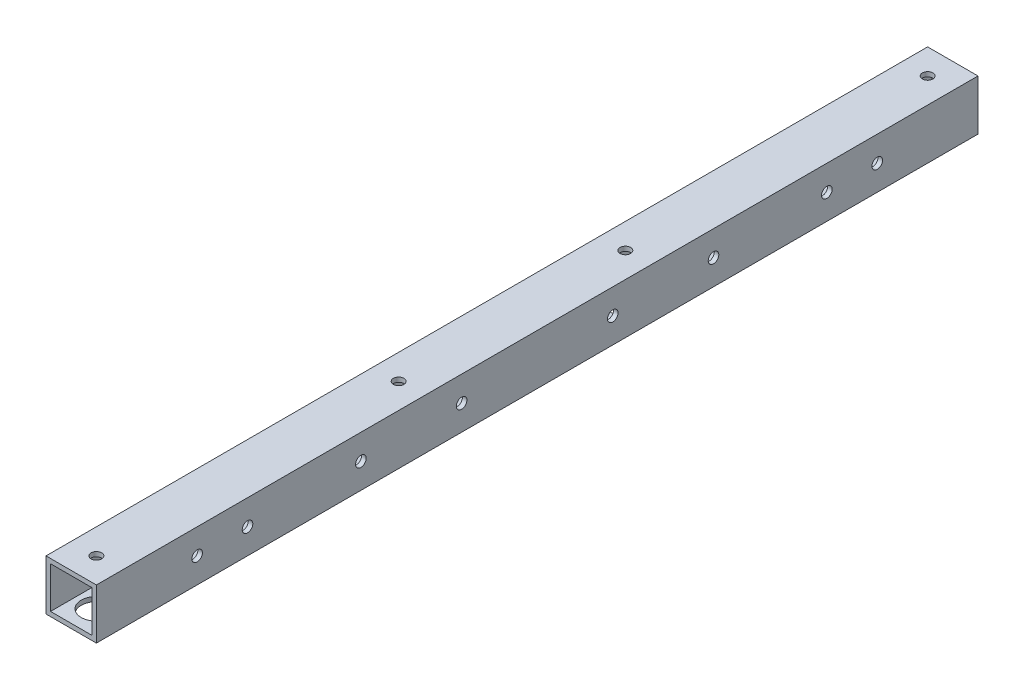
ISO-10303-21;
HEADER;
FILE_DESCRIPTION(('STEP AP214'),'2;1');
FILE_NAME('part.step','',(''),(''),'','','');
FILE_SCHEMA(('AUTOMOTIVE_DESIGN { 1 0 10303 214 1 1 1 1 }'));
ENDSEC;
DATA;
#1=APPLICATION_CONTEXT('core data for automotive mechanical design processes');
#2=APPLICATION_PROTOCOL_DEFINITION('international standard','automotive_design',2000,#1);
#3=PRODUCT_CONTEXT('',#1,'mechanical');
#4=PRODUCT('Part','Part','',(#3));
#5=PRODUCT_RELATED_PRODUCT_CATEGORY('part','',(#4));
#6=PRODUCT_DEFINITION_FORMATION('','',#4);
#7=PRODUCT_DEFINITION_CONTEXT('part definition',#1,'design');
#8=PRODUCT_DEFINITION('design','',#6,#7);
#9=PRODUCT_DEFINITION_SHAPE('','',#8);
#10=(LENGTH_UNIT() NAMED_UNIT(*) SI_UNIT(.MILLI.,.METRE.));
#11=(NAMED_UNIT(*) PLANE_ANGLE_UNIT() SI_UNIT($,.RADIAN.));
#12=(NAMED_UNIT(*) SI_UNIT($,.STERADIAN.) SOLID_ANGLE_UNIT());
#13=UNCERTAINTY_MEASURE_WITH_UNIT(LENGTH_MEASURE(1.E-05),#10,'distance_accuracy_value','');
#14=(GEOMETRIC_REPRESENTATION_CONTEXT(3) GLOBAL_UNCERTAINTY_ASSIGNED_CONTEXT((#13)) GLOBAL_UNIT_ASSIGNED_CONTEXT((#10,
#11,#12)) REPRESENTATION_CONTEXT('',''));
#15=CARTESIAN_POINT('',(0.,0.,0.));
#16=DIRECTION('',(0.,0.,1.));
#17=DIRECTION('',(1.,0.,0.));
#18=AXIS2_PLACEMENT_3D('',#15,#16,#17);
#19=CARTESIAN_POINT('',(0.,0.,-350.));
#20=DIRECTION('',(-1.,0.,0.));
#21=DIRECTION('',(0.,0.,1.));
#22=AXIS2_PLACEMENT_3D('',#19,#20,#21);
#23=PLANE('',#22);
#24=CARTESIAN_POINT('',(0.,10.,-205.));
#25=DIRECTION('',(1.,0.,0.));
#26=DIRECTION('',(0.,0.,-1.));
#27=AXIS2_PLACEMENT_3D('',#24,#25,#26);
#28=CIRCLE('',#27,2.1);
#29=CARTESIAN_POINT('',(0.,10.,-207.1));
#30=VERTEX_POINT('',#29);
#31=EDGE_CURVE('E192',#30,#30,#28,.T.);
#32=ORIENTED_EDGE('',*,*,#31,.T.);
#33=EDGE_LOOP('',(#32));
#34=FACE_BOUND('',#33,.T.);
#35=CARTESIAN_POINT('',(0.,9.99999999999972,-245.));
#36=DIRECTION('',(1.,0.,0.));
#37=DIRECTION('',(0.,0.,-1.));
#38=AXIS2_PLACEMENT_3D('',#35,#36,#37);
#39=CIRCLE('',#38,2.1);
#40=CARTESIAN_POINT('',(0.,9.99999999999972,-247.1));
#41=VERTEX_POINT('',#40);
#42=EDGE_CURVE('E229',#41,#41,#39,.T.);
#43=ORIENTED_EDGE('',*,*,#42,.T.);
#44=EDGE_LOOP('',(#43));
#45=FACE_BOUND('',#44,.T.);
#46=CARTESIAN_POINT('',(0.,10.,-145.));
#47=DIRECTION('',(1.,0.,0.));
#48=DIRECTION('',(0.,0.,-1.));
#49=AXIS2_PLACEMENT_3D('',#46,#47,#48);
#50=CIRCLE('',#49,2.1);
#51=CARTESIAN_POINT('',(0.,10.,-147.1));
#52=VERTEX_POINT('',#51);
#53=EDGE_CURVE('E241',#52,#52,#50,.T.);
#54=ORIENTED_EDGE('',*,*,#53,.T.);
#55=EDGE_LOOP('',(#54));
#56=FACE_BOUND('',#55,.T.);
#57=CARTESIAN_POINT('',(0.,9.99999999999972,-105.));
#58=DIRECTION('',(1.,0.,0.));
#59=DIRECTION('',(0.,0.,-1.));
#60=AXIS2_PLACEMENT_3D('',#57,#58,#59);
#61=CIRCLE('',#60,2.1);
#62=CARTESIAN_POINT('',(0.,9.99999999999972,-107.1));
#63=VERTEX_POINT('',#62);
#64=EDGE_CURVE('E253',#63,#63,#61,.T.);
#65=ORIENTED_EDGE('',*,*,#64,.T.);
#66=EDGE_LOOP('',(#65));
#67=FACE_BOUND('',#66,.T.);
#68=CARTESIAN_POINT('',(0.,10.,-290.));
#69=DIRECTION('',(1.,0.,0.));
#70=DIRECTION('',(0.,0.,-1.));
#71=AXIS2_PLACEMENT_3D('',#68,#69,#70);
#72=CIRCLE('',#71,2.1);
#73=CARTESIAN_POINT('',(0.,10.,-292.1));
#74=VERTEX_POINT('',#73);
#75=EDGE_CURVE('E188',#74,#74,#72,.T.);
#76=ORIENTED_EDGE('',*,*,#75,.T.);
#77=EDGE_LOOP('',(#76));
#78=FACE_BOUND('',#77,.T.);
#79=CARTESIAN_POINT('',(0.,10.,-310.));
#80=DIRECTION('',(1.,0.,0.));
#81=DIRECTION('',(0.,0.,-1.));
#82=AXIS2_PLACEMENT_3D('',#79,#80,#81);
#83=CIRCLE('',#82,2.1);
#84=CARTESIAN_POINT('',(0.,10.,-312.1));
#85=VERTEX_POINT('',#84);
#86=EDGE_CURVE('E183',#85,#85,#83,.T.);
#87=ORIENTED_EDGE('',*,*,#86,.T.);
#88=EDGE_LOOP('',(#87));
#89=FACE_BOUND('',#88,.T.);
#90=CARTESIAN_POINT('',(0.,10.,-60.));
#91=DIRECTION('',(1.,0.,0.));
#92=DIRECTION('',(0.,0.,-1.));
#93=AXIS2_PLACEMENT_3D('',#90,#91,#92);
#94=CIRCLE('',#93,2.1);
#95=CARTESIAN_POINT('',(0.,10.,-62.1));
#96=VERTEX_POINT('',#95);
#97=EDGE_CURVE('E178',#96,#96,#94,.T.);
#98=ORIENTED_EDGE('',*,*,#97,.T.);
#99=EDGE_LOOP('',(#98));
#100=FACE_BOUND('',#99,.T.);
#101=CARTESIAN_POINT('',(0.,10.,-40.));
#102=DIRECTION('',(1.,0.,0.));
#103=DIRECTION('',(0.,0.,-1.));
#104=AXIS2_PLACEMENT_3D('',#101,#102,#103);
#105=CIRCLE('',#104,2.1);
#106=CARTESIAN_POINT('',(0.,10.,-42.1));
#107=VERTEX_POINT('',#106);
#108=EDGE_CURVE('E173',#107,#107,#105,.T.);
#109=ORIENTED_EDGE('',*,*,#108,.T.);
#110=EDGE_LOOP('',(#109));
#111=FACE_BOUND('',#110,.T.);
#112=DIRECTION('',(0.,-1.,0.));
#113=VECTOR('',#112,1.);
#114=CARTESIAN_POINT('',(0.,0.,0.));
#115=LINE('',#114,#113);
#116=CARTESIAN_POINT('',(0.,20.,0.));
#117=VERTEX_POINT('',#116);
#118=CARTESIAN_POINT('',(0.,0.,0.));
#119=VERTEX_POINT('',#118);
#120=EDGE_CURVE('E138',#117,#119,#115,.T.);
#121=ORIENTED_EDGE('',*,*,#120,.F.);
#122=DIRECTION('',(0.,0.,1.));
#123=VECTOR('',#122,1.);
#124=CARTESIAN_POINT('',(0.,20.,-350.));
#125=LINE('',#124,#123);
#126=CARTESIAN_POINT('',(0.,20.,-350.));
#127=VERTEX_POINT('',#126);
#128=EDGE_CURVE('E11',#127,#117,#125,.T.);
#129=ORIENTED_EDGE('',*,*,#128,.F.);
#130=DIRECTION('',(0.,-1.,0.));
#131=VECTOR('',#130,1.);
#132=CARTESIAN_POINT('',(0.,0.,-350.));
#133=LINE('',#132,#131);
#134=CARTESIAN_POINT('',(0.,0.,-350.));
#135=VERTEX_POINT('',#134);
#136=EDGE_CURVE('E142',#127,#135,#133,.T.);
#137=ORIENTED_EDGE('',*,*,#136,.T.);
#138=DIRECTION('',(0.,0.,1.));
#139=VECTOR('',#138,1.);
#140=CARTESIAN_POINT('',(0.,0.,-350.));
#141=LINE('',#140,#139);
#142=EDGE_CURVE('E155',#135,#119,#141,.T.);
#143=ORIENTED_EDGE('',*,*,#142,.T.);
#144=EDGE_LOOP('',(#121,#129,#137,#143));
#145=FACE_BOUND('',#144,.T.);
#146=ADVANCED_FACE('F37',(#34,#45,#56,#67,#78,#89,#100,#111,#145),#23,.T.);
#147=CARTESIAN_POINT('',(0.,20.,-350.));
#148=DIRECTION('',(0.,1.,0.));
#149=DIRECTION('',(0.,0.,1.));
#150=AXIS2_PLACEMENT_3D('',#147,#148,#149);
#151=PLANE('',#150);
#152=CARTESIAN_POINT('',(10.,20.,-220.));
#153=DIRECTION('',(0.,1.,0.));
#154=DIRECTION('',(0.,0.,1.));
#155=AXIS2_PLACEMENT_3D('',#152,#153,#154);
#156=CIRCLE('',#155,2.09999999999999);
#157=CARTESIAN_POINT('',(10.,20.,-217.9));
#158=VERTEX_POINT('',#157);
#159=EDGE_CURVE('E701',#158,#158,#156,.T.);
#160=ORIENTED_EDGE('',*,*,#159,.F.);
#161=EDGE_LOOP('',(#160));
#162=FACE_BOUND('',#161,.T.);
#163=CARTESIAN_POINT('',(10.,20.,-130.));
#164=DIRECTION('',(0.,1.,0.));
#165=DIRECTION('',(0.,0.,1.));
#166=AXIS2_PLACEMENT_3D('',#163,#164,#165);
#167=CIRCLE('',#166,2.09999999999999);
#168=CARTESIAN_POINT('',(10.,20.,-127.9));
#169=VERTEX_POINT('',#168);
#170=EDGE_CURVE('E714',#169,#169,#167,.T.);
#171=ORIENTED_EDGE('',*,*,#170,.F.);
#172=EDGE_LOOP('',(#171));
#173=FACE_BOUND('',#172,.T.);
#174=CARTESIAN_POINT('',(10.,20.,-340.));
#175=DIRECTION('',(0.,1.,0.));
#176=DIRECTION('',(0.,0.,1.));
#177=AXIS2_PLACEMENT_3D('',#174,#175,#176);
#178=CIRCLE('',#177,2.09999999999999);
#179=CARTESIAN_POINT('',(10.,20.,-337.9));
#180=VERTEX_POINT('',#179);
#181=EDGE_CURVE('E207',#180,#180,#178,.T.);
#182=ORIENTED_EDGE('',*,*,#181,.F.);
#183=EDGE_LOOP('',(#182));
#184=FACE_BOUND('',#183,.T.);
#185=CARTESIAN_POINT('',(10.,20.,-10.));
#186=DIRECTION('',(0.,1.,0.));
#187=DIRECTION('',(0.,0.,1.));
#188=AXIS2_PLACEMENT_3D('',#185,#186,#187);
#189=CIRCLE('',#188,2.09999999999999);
#190=CARTESIAN_POINT('',(10.,20.,-7.90000000000001));
#191=VERTEX_POINT('',#190);
#192=EDGE_CURVE('E196',#191,#191,#189,.T.);
#193=ORIENTED_EDGE('',*,*,#192,.F.);
#194=EDGE_LOOP('',(#193));
#195=FACE_BOUND('',#194,.T.);
#196=DIRECTION('',(-1.,0.,0.));
#197=VECTOR('',#196,1.);
#198=CARTESIAN_POINT('',(0.,20.,0.));
#199=LINE('',#198,#197);
#200=CARTESIAN_POINT('',(20.,20.,0.));
#201=VERTEX_POINT('',#200);
#202=EDGE_CURVE('E146',#201,#117,#199,.T.);
#203=ORIENTED_EDGE('',*,*,#202,.F.);
#204=DIRECTION('',(0.,0.,1.));
#205=VECTOR('',#204,1.);
#206=CARTESIAN_POINT('',(20.,20.,-350.));
#207=LINE('',#206,#205);
#208=CARTESIAN_POINT('',(20.,20.,-350.));
#209=VERTEX_POINT('',#208);
#210=EDGE_CURVE('E45',#209,#201,#207,.T.);
#211=ORIENTED_EDGE('',*,*,#210,.F.);
#212=DIRECTION('',(-1.,0.,0.));
#213=VECTOR('',#212,1.);
#214=CARTESIAN_POINT('',(0.,20.,-350.));
#215=LINE('',#214,#213);
#216=EDGE_CURVE('E152',#209,#127,#215,.T.);
#217=ORIENTED_EDGE('',*,*,#216,.T.);
#218=ORIENTED_EDGE('',*,*,#128,.T.);
#219=EDGE_LOOP('',(#203,#211,#217,#218));
#220=FACE_BOUND('',#219,.T.);
#221=ADVANCED_FACE('F319',(#162,#173,#184,#195,#220),#151,.T.);
#222=CARTESIAN_POINT('',(20.,20.,-350.));
#223=DIRECTION('',(1.,0.,0.));
#224=DIRECTION('',(0.,1.,0.));
#225=AXIS2_PLACEMENT_3D('',#222,#223,#224);
#226=PLANE('',#225);
#227=CARTESIAN_POINT('',(20.,10.,-205.));
#228=DIRECTION('',(1.,0.,0.));
#229=DIRECTION('',(0.,0.,-1.));
#230=AXIS2_PLACEMENT_3D('',#227,#228,#229);
#231=CIRCLE('',#230,2.09999999999999);
#232=CARTESIAN_POINT('',(20.,10.,-207.1));
#233=VERTEX_POINT('',#232);
#234=EDGE_CURVE('E216',#233,#233,#231,.T.);
#235=ORIENTED_EDGE('',*,*,#234,.F.);
#236=EDGE_LOOP('',(#235));
#237=FACE_BOUND('',#236,.T.);
#238=CARTESIAN_POINT('',(20.,9.99999999999972,-245.));
#239=DIRECTION('',(1.,0.,0.));
#240=DIRECTION('',(0.,0.,-1.));
#241=AXIS2_PLACEMENT_3D('',#238,#239,#240);
#242=CIRCLE('',#241,2.09999999999999);
#243=CARTESIAN_POINT('',(20.,9.99999999999972,-247.1));
#244=VERTEX_POINT('',#243);
#245=EDGE_CURVE('E226',#244,#244,#242,.T.);
#246=ORIENTED_EDGE('',*,*,#245,.F.);
#247=EDGE_LOOP('',(#246));
#248=FACE_BOUND('',#247,.T.);
#249=CARTESIAN_POINT('',(20.,10.,-145.));
#250=DIRECTION('',(1.,0.,0.));
#251=DIRECTION('',(0.,0.,-1.));
#252=AXIS2_PLACEMENT_3D('',#249,#250,#251);
#253=CIRCLE('',#252,2.09999999999999);
#254=CARTESIAN_POINT('',(20.,10.,-147.1));
#255=VERTEX_POINT('',#254);
#256=EDGE_CURVE('E238',#255,#255,#253,.T.);
#257=ORIENTED_EDGE('',*,*,#256,.F.);
#258=EDGE_LOOP('',(#257));
#259=FACE_BOUND('',#258,.T.);
#260=CARTESIAN_POINT('',(20.,9.99999999999972,-105.));
#261=DIRECTION('',(1.,0.,0.));
#262=DIRECTION('',(0.,0.,-1.));
#263=AXIS2_PLACEMENT_3D('',#260,#261,#262);
#264=CIRCLE('',#263,2.09999999999999);
#265=CARTESIAN_POINT('',(20.,9.99999999999972,-107.1));
#266=VERTEX_POINT('',#265);
#267=EDGE_CURVE('E250',#266,#266,#264,.T.);
#268=ORIENTED_EDGE('',*,*,#267,.F.);
#269=EDGE_LOOP('',(#268));
#270=FACE_BOUND('',#269,.T.);
#271=CARTESIAN_POINT('',(20.,10.,-290.));
#272=DIRECTION('',(1.,0.,0.));
#273=DIRECTION('',(0.,0.,-1.));
#274=AXIS2_PLACEMENT_3D('',#271,#272,#273);
#275=CIRCLE('',#274,2.09999999999999);
#276=CARTESIAN_POINT('',(20.,10.,-292.1));
#277=VERTEX_POINT('',#276);
#278=EDGE_CURVE('E262',#277,#277,#275,.T.);
#279=ORIENTED_EDGE('',*,*,#278,.F.);
#280=EDGE_LOOP('',(#279));
#281=FACE_BOUND('',#280,.T.);
#282=CARTESIAN_POINT('',(20.,10.,-310.));
#283=DIRECTION('',(1.,0.,0.));
#284=DIRECTION('',(0.,0.,-1.));
#285=AXIS2_PLACEMENT_3D('',#282,#283,#284);
#286=CIRCLE('',#285,2.09999999999999);
#287=CARTESIAN_POINT('',(20.,10.,-312.1));
#288=VERTEX_POINT('',#287);
#289=EDGE_CURVE('E269',#288,#288,#286,.T.);
#290=ORIENTED_EDGE('',*,*,#289,.F.);
#291=EDGE_LOOP('',(#290));
#292=FACE_BOUND('',#291,.T.);
#293=CARTESIAN_POINT('',(20.,10.,-60.));
#294=DIRECTION('',(1.,0.,0.));
#295=DIRECTION('',(0.,0.,-1.));
#296=AXIS2_PLACEMENT_3D('',#293,#294,#295);
#297=CIRCLE('',#296,2.09999999999999);
#298=CARTESIAN_POINT('',(20.,10.,-62.1));
#299=VERTEX_POINT('',#298);
#300=EDGE_CURVE('E276',#299,#299,#297,.T.);
#301=ORIENTED_EDGE('',*,*,#300,.F.);
#302=EDGE_LOOP('',(#301));
#303=FACE_BOUND('',#302,.T.);
#304=CARTESIAN_POINT('',(20.,10.,-40.));
#305=DIRECTION('',(1.,0.,0.));
#306=DIRECTION('',(0.,0.,-1.));
#307=AXIS2_PLACEMENT_3D('',#304,#305,#306);
#308=CIRCLE('',#307,2.09999999999999);
#309=CARTESIAN_POINT('',(20.,10.,-42.1));
#310=VERTEX_POINT('',#309);
#311=EDGE_CURVE('E283',#310,#310,#308,.T.);
#312=ORIENTED_EDGE('',*,*,#311,.F.);
#313=EDGE_LOOP('',(#312));
#314=FACE_BOUND('',#313,.T.);
#315=DIRECTION('',(0.,1.,0.));
#316=VECTOR('',#315,1.);
#317=CARTESIAN_POINT('',(20.,20.,0.));
#318=LINE('',#317,#316);
#319=CARTESIAN_POINT('',(20.,0.,0.));
#320=VERTEX_POINT('',#319);
#321=EDGE_CURVE('E161',#320,#201,#318,.T.);
#322=ORIENTED_EDGE('',*,*,#321,.F.);
#323=DIRECTION('',(0.,0.,1.));
#324=VECTOR('',#323,1.);
#325=CARTESIAN_POINT('',(20.,0.,-350.));
#326=LINE('',#325,#324);
#327=CARTESIAN_POINT('',(20.,0.,-350.));
#328=VERTEX_POINT('',#327);
#329=EDGE_CURVE('E167',#328,#320,#326,.T.);
#330=ORIENTED_EDGE('',*,*,#329,.F.);
#331=DIRECTION('',(0.,1.,0.));
#332=VECTOR('',#331,1.);
#333=CARTESIAN_POINT('',(20.,20.,-350.));
#334=LINE('',#333,#332);
#335=EDGE_CURVE('E149',#328,#209,#334,.T.);
#336=ORIENTED_EDGE('',*,*,#335,.T.);
#337=ORIENTED_EDGE('',*,*,#210,.T.);
#338=EDGE_LOOP('',(#322,#330,#336,#337));
#339=FACE_BOUND('',#338,.T.);
#340=ADVANCED_FACE('F325',(#237,#248,#259,#270,#281,#292,#303,#314,#339),#226,.T.);
#341=CARTESIAN_POINT('',(0.,0.,-350.));
#342=DIRECTION('',(0.,-1.,0.));
#343=DIRECTION('',(0.,0.,-1.));
#344=AXIS2_PLACEMENT_3D('',#341,#342,#343);
#345=PLANE('',#344);
#346=CARTESIAN_POINT('',(10.,0.,-130.));
#347=DIRECTION('',(0.,-1.,0.));
#348=DIRECTION('',(0.,0.,-1.));
#349=AXIS2_PLACEMENT_3D('',#346,#347,#348);
#350=CIRCLE('',#349,6.);
#351=CARTESIAN_POINT('',(10.,0.,-136.));
#352=VERTEX_POINT('',#351);
#353=EDGE_CURVE('E700',#352,#352,#350,.T.);
#354=ORIENTED_EDGE('',*,*,#353,.F.);
#355=EDGE_LOOP('',(#354));
#356=FACE_BOUND('',#355,.T.);
#357=CARTESIAN_POINT('',(10.,0.,-220.));
#358=DIRECTION('',(0.,-1.,0.));
#359=DIRECTION('',(0.,0.,-1.));
#360=AXIS2_PLACEMENT_3D('',#357,#358,#359);
#361=CIRCLE('',#360,6.);
#362=CARTESIAN_POINT('',(10.,0.,-226.));
#363=VERTEX_POINT('',#362);
#364=EDGE_CURVE('E708',#363,#363,#361,.T.);
#365=ORIENTED_EDGE('',*,*,#364,.F.);
#366=EDGE_LOOP('',(#365));
#367=FACE_BOUND('',#366,.T.);
#368=CARTESIAN_POINT('',(10.,0.,-10.));
#369=DIRECTION('',(0.,-1.,0.));
#370=DIRECTION('',(0.,0.,-1.));
#371=AXIS2_PLACEMENT_3D('',#368,#369,#370);
#372=CIRCLE('',#371,6.);
#373=CARTESIAN_POINT('',(10.,0.,-16.));
#374=VERTEX_POINT('',#373);
#375=EDGE_CURVE('E214',#374,#374,#372,.T.);
#376=ORIENTED_EDGE('',*,*,#375,.F.);
#377=EDGE_LOOP('',(#376));
#378=FACE_BOUND('',#377,.T.);
#379=CARTESIAN_POINT('',(10.,0.,-340.));
#380=DIRECTION('',(0.,-1.,0.));
#381=DIRECTION('',(0.,0.,-1.));
#382=AXIS2_PLACEMENT_3D('',#379,#380,#381);
#383=CIRCLE('',#382,6.);
#384=CARTESIAN_POINT('',(10.,0.,-346.));
#385=VERTEX_POINT('',#384);
#386=EDGE_CURVE('E200',#385,#385,#383,.T.);
#387=ORIENTED_EDGE('',*,*,#386,.F.);
#388=EDGE_LOOP('',(#387));
#389=FACE_BOUND('',#388,.T.);
#390=DIRECTION('',(1.,0.,0.));
#391=VECTOR('',#390,1.);
#392=CARTESIAN_POINT('',(0.,0.,0.));
#393=LINE('',#392,#391);
#394=EDGE_CURVE('E158',#119,#320,#393,.T.);
#395=ORIENTED_EDGE('',*,*,#394,.F.);
#396=ORIENTED_EDGE('',*,*,#142,.F.);
#397=DIRECTION('',(1.,0.,0.));
#398=VECTOR('',#397,1.);
#399=CARTESIAN_POINT('',(0.,0.,-350.));
#400=LINE('',#399,#398);
#401=EDGE_CURVE('E145',#135,#328,#400,.T.);
#402=ORIENTED_EDGE('',*,*,#401,.T.);
#403=ORIENTED_EDGE('',*,*,#329,.T.);
#404=EDGE_LOOP('',(#395,#396,#402,#403));
#405=FACE_BOUND('',#404,.T.);
#406=ADVANCED_FACE('F450',(#356,#367,#378,#389,#405),#345,.T.);
#407=CARTESIAN_POINT('',(0.,20.,-350.));
#408=DIRECTION('',(0.,0.,-1.));
#409=DIRECTION('',(-1.,0.,0.));
#410=AXIS2_PLACEMENT_3D('',#407,#408,#409);
#411=PLANE('',#410);
#412=DIRECTION('',(0.,-1.,0.));
#413=VECTOR('',#412,1.);
#414=CARTESIAN_POINT('',(1.8,1.8,-350.));
#415=LINE('',#414,#413);
#416=CARTESIAN_POINT('',(1.8,18.2,-350.));
#417=VERTEX_POINT('',#416);
#418=CARTESIAN_POINT('',(1.8,1.8,-350.));
#419=VERTEX_POINT('',#418);
#420=EDGE_CURVE('E104',#417,#419,#415,.T.);
#421=ORIENTED_EDGE('',*,*,#420,.T.);
#422=DIRECTION('',(1.,0.,0.));
#423=VECTOR('',#422,1.);
#424=CARTESIAN_POINT('',(1.8,1.8,-350.));
#425=LINE('',#424,#423);
#426=CARTESIAN_POINT('',(18.2,1.8,-350.));
#427=VERTEX_POINT('',#426);
#428=EDGE_CURVE('E113',#419,#427,#425,.T.);
#429=ORIENTED_EDGE('',*,*,#428,.T.);
#430=DIRECTION('',(0.,1.,0.));
#431=VECTOR('',#430,1.);
#432=CARTESIAN_POINT('',(18.2,18.2,-350.));
#433=LINE('',#432,#431);
#434=CARTESIAN_POINT('',(18.2,18.2,-350.));
#435=VERTEX_POINT('',#434);
#436=EDGE_CURVE('E53',#427,#435,#433,.T.);
#437=ORIENTED_EDGE('',*,*,#436,.T.);
#438=DIRECTION('',(-1.,0.,0.));
#439=VECTOR('',#438,1.);
#440=CARTESIAN_POINT('',(1.8,18.2,-350.));
#441=LINE('',#440,#439);
#442=EDGE_CURVE('E110',#435,#417,#441,.T.);
#443=ORIENTED_EDGE('',*,*,#442,.T.);
#444=EDGE_LOOP('',(#421,#429,#437,#443));
#445=FACE_BOUND('',#444,.T.);
#446=ORIENTED_EDGE('',*,*,#136,.F.);
#447=ORIENTED_EDGE('',*,*,#216,.F.);
#448=ORIENTED_EDGE('',*,*,#335,.F.);
#449=ORIENTED_EDGE('',*,*,#401,.F.);
#450=EDGE_LOOP('',(#446,#447,#448,#449));
#451=FACE_BOUND('',#450,.T.);
#452=ADVANCED_FACE('F117',(#445,#451),#411,.T.);
#453=CARTESIAN_POINT('',(0.,20.,0.));
#454=DIRECTION('',(0.,0.,-1.));
#455=DIRECTION('',(-1.,0.,0.));
#456=AXIS2_PLACEMENT_3D('',#453,#454,#455);
#457=PLANE('',#456);
#458=DIRECTION('',(1.,0.,0.));
#459=VECTOR('',#458,1.);
#460=CARTESIAN_POINT('',(1.8,1.8,0.));
#461=LINE('',#460,#459);
#462=CARTESIAN_POINT('',(1.8,1.8,0.));
#463=VERTEX_POINT('',#462);
#464=CARTESIAN_POINT('',(18.2,1.8,0.));
#465=VERTEX_POINT('',#464);
#466=EDGE_CURVE('E132',#463,#465,#461,.T.);
#467=ORIENTED_EDGE('',*,*,#466,.F.);
#468=DIRECTION('',(0.,-1.,0.));
#469=VECTOR('',#468,1.);
#470=CARTESIAN_POINT('',(1.8,1.8,0.));
#471=LINE('',#470,#469);
#472=CARTESIAN_POINT('',(1.8,18.2,0.));
#473=VERTEX_POINT('',#472);
#474=EDGE_CURVE('E61',#473,#463,#471,.T.);
#475=ORIENTED_EDGE('',*,*,#474,.F.);
#476=DIRECTION('',(-1.,0.,0.));
#477=VECTOR('',#476,1.);
#478=CARTESIAN_POINT('',(1.8,18.2,0.));
#479=LINE('',#478,#477);
#480=CARTESIAN_POINT('',(18.2,18.2,0.));
#481=VERTEX_POINT('',#480);
#482=EDGE_CURVE('E120',#481,#473,#479,.T.);
#483=ORIENTED_EDGE('',*,*,#482,.F.);
#484=DIRECTION('',(0.,1.,0.));
#485=VECTOR('',#484,1.);
#486=CARTESIAN_POINT('',(18.2,18.2,0.));
#487=LINE('',#486,#485);
#488=EDGE_CURVE('E123',#465,#481,#487,.T.);
#489=ORIENTED_EDGE('',*,*,#488,.F.);
#490=EDGE_LOOP('',(#467,#475,#483,#489));
#491=FACE_BOUND('',#490,.T.);
#492=ORIENTED_EDGE('',*,*,#120,.T.);
#493=ORIENTED_EDGE('',*,*,#394,.T.);
#494=ORIENTED_EDGE('',*,*,#321,.T.);
#495=ORIENTED_EDGE('',*,*,#202,.T.);
#496=EDGE_LOOP('',(#492,#493,#494,#495));
#497=FACE_BOUND('',#496,.T.);
#498=ADVANCED_FACE('F301',(#491,#497),#457,.F.);
#499=CARTESIAN_POINT('',(1.8,1.8,-350.));
#500=DIRECTION('',(-1.,0.,0.));
#501=DIRECTION('',(0.,0.,1.));
#502=AXIS2_PLACEMENT_3D('',#499,#500,#501);
#503=PLANE('',#502);
#504=CARTESIAN_POINT('',(1.8,10.,-205.));
#505=DIRECTION('',(-1.,0.,0.));
#506=DIRECTION('',(0.,0.,1.));
#507=AXIS2_PLACEMENT_3D('',#504,#505,#506);
#508=CIRCLE('',#507,2.09999999999999);
#509=CARTESIAN_POINT('',(1.8,10.,-202.9));
#510=VERTEX_POINT('',#509);
#511=EDGE_CURVE('E191',#510,#510,#508,.T.);
#512=ORIENTED_EDGE('',*,*,#511,.T.);
#513=EDGE_LOOP('',(#512));
#514=FACE_BOUND('',#513,.T.);
#515=CARTESIAN_POINT('',(1.8,9.99999999999972,-245.));
#516=DIRECTION('',(-1.,0.,0.));
#517=DIRECTION('',(0.,0.,1.));
#518=AXIS2_PLACEMENT_3D('',#515,#516,#517);
#519=CIRCLE('',#518,2.09999999999999);
#520=CARTESIAN_POINT('',(1.8,9.99999999999972,-242.9));
#521=VERTEX_POINT('',#520);
#522=EDGE_CURVE('E232',#521,#521,#519,.T.);
#523=ORIENTED_EDGE('',*,*,#522,.T.);
#524=EDGE_LOOP('',(#523));
#525=FACE_BOUND('',#524,.T.);
#526=CARTESIAN_POINT('',(1.8,10.,-145.));
#527=DIRECTION('',(-1.,0.,0.));
#528=DIRECTION('',(0.,0.,1.));
#529=AXIS2_PLACEMENT_3D('',#526,#527,#528);
#530=CIRCLE('',#529,2.09999999999999);
#531=CARTESIAN_POINT('',(1.8,10.,-142.9));
#532=VERTEX_POINT('',#531);
#533=EDGE_CURVE('E247',#532,#532,#530,.T.);
#534=ORIENTED_EDGE('',*,*,#533,.T.);
#535=EDGE_LOOP('',(#534));
#536=FACE_BOUND('',#535,.T.);
#537=CARTESIAN_POINT('',(1.8,9.99999999999972,-105.));
#538=DIRECTION('',(-1.,0.,0.));
#539=DIRECTION('',(0.,0.,1.));
#540=AXIS2_PLACEMENT_3D('',#537,#538,#539);
#541=CIRCLE('',#540,2.09999999999999);
#542=CARTESIAN_POINT('',(1.8,9.99999999999972,-102.9));
#543=VERTEX_POINT('',#542);
#544=EDGE_CURVE('E259',#543,#543,#541,.T.);
#545=ORIENTED_EDGE('',*,*,#544,.T.);
#546=EDGE_LOOP('',(#545));
#547=FACE_BOUND('',#546,.T.);
#548=CARTESIAN_POINT('',(1.8,10.,-290.));
#549=DIRECTION('',(-1.,0.,0.));
#550=DIRECTION('',(0.,0.,1.));
#551=AXIS2_PLACEMENT_3D('',#548,#549,#550);
#552=CIRCLE('',#551,2.09999999999999);
#553=CARTESIAN_POINT('',(1.8,10.,-287.9));
#554=VERTEX_POINT('',#553);
#555=EDGE_CURVE('E187',#554,#554,#552,.T.);
#556=ORIENTED_EDGE('',*,*,#555,.T.);
#557=EDGE_LOOP('',(#556));
#558=FACE_BOUND('',#557,.T.);
#559=CARTESIAN_POINT('',(1.8,10.,-310.));
#560=DIRECTION('',(-1.,0.,0.));
#561=DIRECTION('',(0.,0.,1.));
#562=AXIS2_PLACEMENT_3D('',#559,#560,#561);
#563=CIRCLE('',#562,2.09999999999999);
#564=CARTESIAN_POINT('',(1.8,10.,-307.9));
#565=VERTEX_POINT('',#564);
#566=EDGE_CURVE('E182',#565,#565,#563,.T.);
#567=ORIENTED_EDGE('',*,*,#566,.T.);
#568=EDGE_LOOP('',(#567));
#569=FACE_BOUND('',#568,.T.);
#570=CARTESIAN_POINT('',(1.8,10.,-60.));
#571=DIRECTION('',(-1.,0.,0.));
#572=DIRECTION('',(0.,0.,1.));
#573=AXIS2_PLACEMENT_3D('',#570,#571,#572);
#574=CIRCLE('',#573,2.09999999999999);
#575=CARTESIAN_POINT('',(1.8,10.,-57.9));
#576=VERTEX_POINT('',#575);
#577=EDGE_CURVE('E174',#576,#576,#574,.T.);
#578=ORIENTED_EDGE('',*,*,#577,.T.);
#579=EDGE_LOOP('',(#578));
#580=FACE_BOUND('',#579,.T.);
#581=CARTESIAN_POINT('',(1.8,10.,-40.));
#582=DIRECTION('',(-1.,0.,0.));
#583=DIRECTION('',(0.,0.,1.));
#584=AXIS2_PLACEMENT_3D('',#581,#582,#583);
#585=CIRCLE('',#584,2.09999999999999);
#586=CARTESIAN_POINT('',(1.8,10.,-37.9));
#587=VERTEX_POINT('',#586);
#588=EDGE_CURVE('E126',#587,#587,#585,.T.);
#589=ORIENTED_EDGE('',*,*,#588,.T.);
#590=EDGE_LOOP('',(#589));
#591=FACE_BOUND('',#590,.T.);
#592=ORIENTED_EDGE('',*,*,#474,.T.);
#593=DIRECTION('',(0.,0.,1.));
#594=VECTOR('',#593,1.);
#595=CARTESIAN_POINT('',(1.8,1.8,-350.));
#596=LINE('',#595,#594);
#597=EDGE_CURVE('E100',#419,#463,#596,.T.);
#598=ORIENTED_EDGE('',*,*,#597,.F.);
#599=ORIENTED_EDGE('',*,*,#420,.F.);
#600=DIRECTION('',(0.,0.,1.));
#601=VECTOR('',#600,1.);
#602=CARTESIAN_POINT('',(1.8,18.2,-350.));
#603=LINE('',#602,#601);
#604=EDGE_CURVE('E136',#417,#473,#603,.T.);
#605=ORIENTED_EDGE('',*,*,#604,.T.);
#606=EDGE_LOOP('',(#592,#598,#599,#605));
#607=FACE_BOUND('',#606,.T.);
#608=ADVANCED_FACE('F102',(#514,#525,#536,#547,#558,#569,#580,#591,#607),#503,.F.);
#609=CARTESIAN_POINT('',(1.8,18.2,-350.));
#610=DIRECTION('',(0.,1.,0.));
#611=DIRECTION('',(0.,0.,1.));
#612=AXIS2_PLACEMENT_3D('',#609,#610,#611);
#613=PLANE('',#612);
#614=CARTESIAN_POINT('',(10.,18.2,-220.));
#615=DIRECTION('',(0.,1.,0.));
#616=DIRECTION('',(0.,0.,1.));
#617=AXIS2_PLACEMENT_3D('',#614,#615,#616);
#618=CIRCLE('',#617,2.09999999999999);
#619=CARTESIAN_POINT('',(10.,18.2,-217.9));
#620=VERTEX_POINT('',#619);
#621=EDGE_CURVE('E704',#620,#620,#618,.T.);
#622=ORIENTED_EDGE('',*,*,#621,.T.);
#623=EDGE_LOOP('',(#622));
#624=FACE_BOUND('',#623,.T.);
#625=CARTESIAN_POINT('',(10.,18.2,-130.));
#626=DIRECTION('',(0.,1.,0.));
#627=DIRECTION('',(0.,0.,1.));
#628=AXIS2_PLACEMENT_3D('',#625,#626,#627);
#629=CIRCLE('',#628,2.09999999999999);
#630=CARTESIAN_POINT('',(10.,18.2,-127.9));
#631=VERTEX_POINT('',#630);
#632=EDGE_CURVE('E716',#631,#631,#629,.T.);
#633=ORIENTED_EDGE('',*,*,#632,.T.);
#634=EDGE_LOOP('',(#633));
#635=FACE_BOUND('',#634,.T.);
#636=CARTESIAN_POINT('',(10.,18.2,-340.));
#637=DIRECTION('',(0.,1.,0.));
#638=DIRECTION('',(0.,0.,1.));
#639=AXIS2_PLACEMENT_3D('',#636,#637,#638);
#640=CIRCLE('',#639,2.09999999999999);
#641=CARTESIAN_POINT('',(10.,18.2,-337.9));
#642=VERTEX_POINT('',#641);
#643=EDGE_CURVE('E40',#642,#642,#640,.T.);
#644=ORIENTED_EDGE('',*,*,#643,.T.);
#645=EDGE_LOOP('',(#644));
#646=FACE_BOUND('',#645,.T.);
#647=CARTESIAN_POINT('',(10.,18.2,-10.));
#648=DIRECTION('',(0.,1.,0.));
#649=DIRECTION('',(0.,0.,1.));
#650=AXIS2_PLACEMENT_3D('',#647,#648,#649);
#651=CIRCLE('',#650,2.09999999999999);
#652=CARTESIAN_POINT('',(10.,18.2,-7.90000000000001));
#653=VERTEX_POINT('',#652);
#654=EDGE_CURVE('E193',#653,#653,#651,.T.);
#655=ORIENTED_EDGE('',*,*,#654,.T.);
#656=EDGE_LOOP('',(#655));
#657=FACE_BOUND('',#656,.T.);
#658=ORIENTED_EDGE('',*,*,#482,.T.);
#659=ORIENTED_EDGE('',*,*,#604,.F.);
#660=ORIENTED_EDGE('',*,*,#442,.F.);
#661=DIRECTION('',(0.,0.,1.));
#662=VECTOR('',#661,1.);
#663=CARTESIAN_POINT('',(18.2,18.2,-350.));
#664=LINE('',#663,#662);
#665=EDGE_CURVE('E139',#435,#481,#664,.T.);
#666=ORIENTED_EDGE('',*,*,#665,.T.);
#667=EDGE_LOOP('',(#658,#659,#660,#666));
#668=FACE_BOUND('',#667,.T.);
#669=ADVANCED_FACE('F300',(#624,#635,#646,#657,#668),#613,.F.);
#670=CARTESIAN_POINT('',(18.2,18.2,-350.));
#671=DIRECTION('',(1.,0.,0.));
#672=DIRECTION('',(0.,1.,0.));
#673=AXIS2_PLACEMENT_3D('',#670,#671,#672);
#674=PLANE('',#673);
#675=CARTESIAN_POINT('',(18.2,10.,-205.));
#676=DIRECTION('',(1.,0.,0.));
#677=DIRECTION('',(0.,1.,0.));
#678=AXIS2_PLACEMENT_3D('',#675,#676,#677);
#679=CIRCLE('',#678,2.09999999999999);
#680=CARTESIAN_POINT('',(18.2,12.1,-205.));
#681=VERTEX_POINT('',#680);
#682=EDGE_CURVE('E189',#681,#681,#679,.T.);
#683=ORIENTED_EDGE('',*,*,#682,.T.);
#684=EDGE_LOOP('',(#683));
#685=FACE_BOUND('',#684,.T.);
#686=CARTESIAN_POINT('',(18.2,9.99999999999972,-245.));
#687=DIRECTION('',(1.,0.,0.));
#688=DIRECTION('',(0.,1.,0.));
#689=AXIS2_PLACEMENT_3D('',#686,#687,#688);
#690=CIRCLE('',#689,2.09999999999999);
#691=CARTESIAN_POINT('',(18.2,12.0999999999997,-245.));
#692=VERTEX_POINT('',#691);
#693=EDGE_CURVE('E235',#692,#692,#690,.T.);
#694=ORIENTED_EDGE('',*,*,#693,.T.);
#695=EDGE_LOOP('',(#694));
#696=FACE_BOUND('',#695,.T.);
#697=CARTESIAN_POINT('',(18.2,10.,-145.));
#698=DIRECTION('',(1.,0.,0.));
#699=DIRECTION('',(0.,1.,0.));
#700=AXIS2_PLACEMENT_3D('',#697,#698,#699);
#701=CIRCLE('',#700,2.09999999999999);
#702=CARTESIAN_POINT('',(18.2,12.1,-145.));
#703=VERTEX_POINT('',#702);
#704=EDGE_CURVE('E244',#703,#703,#701,.T.);
#705=ORIENTED_EDGE('',*,*,#704,.T.);
#706=EDGE_LOOP('',(#705));
#707=FACE_BOUND('',#706,.T.);
#708=CARTESIAN_POINT('',(18.2,9.99999999999972,-105.));
#709=DIRECTION('',(1.,0.,0.));
#710=DIRECTION('',(0.,1.,0.));
#711=AXIS2_PLACEMENT_3D('',#708,#709,#710);
#712=CIRCLE('',#711,2.09999999999999);
#713=CARTESIAN_POINT('',(18.2,12.0999999999997,-105.));
#714=VERTEX_POINT('',#713);
#715=EDGE_CURVE('E256',#714,#714,#712,.T.);
#716=ORIENTED_EDGE('',*,*,#715,.T.);
#717=EDGE_LOOP('',(#716));
#718=FACE_BOUND('',#717,.T.);
#719=CARTESIAN_POINT('',(18.2,10.,-290.));
#720=DIRECTION('',(1.,0.,0.));
#721=DIRECTION('',(0.,1.,0.));
#722=AXIS2_PLACEMENT_3D('',#719,#720,#721);
#723=CIRCLE('',#722,2.09999999999999);
#724=CARTESIAN_POINT('',(18.2,12.1,-290.));
#725=VERTEX_POINT('',#724);
#726=EDGE_CURVE('E184',#725,#725,#723,.T.);
#727=ORIENTED_EDGE('',*,*,#726,.T.);
#728=EDGE_LOOP('',(#727));
#729=FACE_BOUND('',#728,.T.);
#730=CARTESIAN_POINT('',(18.2,10.,-310.));
#731=DIRECTION('',(1.,0.,0.));
#732=DIRECTION('',(0.,1.,0.));
#733=AXIS2_PLACEMENT_3D('',#730,#731,#732);
#734=CIRCLE('',#733,2.09999999999999);
#735=CARTESIAN_POINT('',(18.2,12.1,-310.));
#736=VERTEX_POINT('',#735);
#737=EDGE_CURVE('E179',#736,#736,#734,.T.);
#738=ORIENTED_EDGE('',*,*,#737,.T.);
#739=EDGE_LOOP('',(#738));
#740=FACE_BOUND('',#739,.T.);
#741=CARTESIAN_POINT('',(18.2,10.,-60.));
#742=DIRECTION('',(1.,0.,0.));
#743=DIRECTION('',(0.,1.,0.));
#744=AXIS2_PLACEMENT_3D('',#741,#742,#743);
#745=CIRCLE('',#744,2.09999999999999);
#746=CARTESIAN_POINT('',(18.2,12.1,-60.));
#747=VERTEX_POINT('',#746);
#748=EDGE_CURVE('E177',#747,#747,#745,.T.);
#749=ORIENTED_EDGE('',*,*,#748,.T.);
#750=EDGE_LOOP('',(#749));
#751=FACE_BOUND('',#750,.T.);
#752=CARTESIAN_POINT('',(18.2,10.,-40.));
#753=DIRECTION('',(1.,0.,0.));
#754=DIRECTION('',(0.,1.,0.));
#755=AXIS2_PLACEMENT_3D('',#752,#753,#754);
#756=CIRCLE('',#755,2.09999999999999);
#757=CARTESIAN_POINT('',(18.2,12.1,-40.));
#758=VERTEX_POINT('',#757);
#759=EDGE_CURVE('E170',#758,#758,#756,.T.);
#760=ORIENTED_EDGE('',*,*,#759,.T.);
#761=EDGE_LOOP('',(#760));
#762=FACE_BOUND('',#761,.T.);
#763=ORIENTED_EDGE('',*,*,#488,.T.);
#764=ORIENTED_EDGE('',*,*,#665,.F.);
#765=ORIENTED_EDGE('',*,*,#436,.F.);
#766=DIRECTION('',(0.,0.,1.));
#767=VECTOR('',#766,1.);
#768=CARTESIAN_POINT('',(18.2,1.8,-350.));
#769=LINE('',#768,#767);
#770=EDGE_CURVE('E109',#427,#465,#769,.T.);
#771=ORIENTED_EDGE('',*,*,#770,.T.);
#772=EDGE_LOOP('',(#763,#764,#765,#771));
#773=FACE_BOUND('',#772,.T.);
#774=ADVANCED_FACE('F309',(#685,#696,#707,#718,#729,#740,#751,#762,#773),#674,.F.);
#775=CARTESIAN_POINT('',(1.8,1.8,-350.));
#776=DIRECTION('',(0.,-1.,0.));
#777=DIRECTION('',(1.,0.,0.));
#778=AXIS2_PLACEMENT_3D('',#775,#776,#777);
#779=PLANE('',#778);
#780=CARTESIAN_POINT('',(10.,1.8,-130.));
#781=DIRECTION('',(0.,-1.,0.));
#782=DIRECTION('',(1.,0.,0.));
#783=AXIS2_PLACEMENT_3D('',#780,#781,#782);
#784=CIRCLE('',#783,6.);
#785=CARTESIAN_POINT('',(16.,1.8,-130.));
#786=VERTEX_POINT('',#785);
#787=EDGE_CURVE('E369',#786,#786,#784,.F.);
#788=ORIENTED_EDGE('',*,*,#787,.F.);
#789=EDGE_LOOP('',(#788));
#790=FACE_BOUND('',#789,.T.);
#791=CARTESIAN_POINT('',(10.,1.8,-220.));
#792=DIRECTION('',(0.,-1.,0.));
#793=DIRECTION('',(1.,0.,0.));
#794=AXIS2_PLACEMENT_3D('',#791,#792,#793);
#795=CIRCLE('',#794,6.);
#796=CARTESIAN_POINT('',(16.,1.8,-220.));
#797=VERTEX_POINT('',#796);
#798=EDGE_CURVE('E373',#797,#797,#795,.F.);
#799=ORIENTED_EDGE('',*,*,#798,.F.);
#800=EDGE_LOOP('',(#799));
#801=FACE_BOUND('',#800,.T.);
#802=CARTESIAN_POINT('',(10.,1.8,-10.));
#803=DIRECTION('',(0.,-1.,0.));
#804=DIRECTION('',(1.,0.,0.));
#805=AXIS2_PLACEMENT_3D('',#802,#803,#804);
#806=CIRCLE('',#805,6.);
#807=CARTESIAN_POINT('',(16.,1.8,-10.));
#808=VERTEX_POINT('',#807);
#809=EDGE_CURVE('E211',#808,#808,#806,.F.);
#810=ORIENTED_EDGE('',*,*,#809,.F.);
#811=EDGE_LOOP('',(#810));
#812=FACE_BOUND('',#811,.T.);
#813=CARTESIAN_POINT('',(10.,1.8,-340.));
#814=DIRECTION('',(0.,-1.,0.));
#815=DIRECTION('',(1.,0.,0.));
#816=AXIS2_PLACEMENT_3D('',#813,#814,#815);
#817=CIRCLE('',#816,6.);
#818=CARTESIAN_POINT('',(16.,1.8,-340.));
#819=VERTEX_POINT('',#818);
#820=EDGE_CURVE('E195',#819,#819,#817,.F.);
#821=ORIENTED_EDGE('',*,*,#820,.F.);
#822=EDGE_LOOP('',(#821));
#823=FACE_BOUND('',#822,.T.);
#824=ORIENTED_EDGE('',*,*,#466,.T.);
#825=ORIENTED_EDGE('',*,*,#770,.F.);
#826=ORIENTED_EDGE('',*,*,#428,.F.);
#827=ORIENTED_EDGE('',*,*,#597,.T.);
#828=EDGE_LOOP('',(#824,#825,#826,#827));
#829=FACE_BOUND('',#828,.T.);
#830=ADVANCED_FACE('F114',(#790,#801,#812,#823,#829),#779,.F.);
#831=CARTESIAN_POINT('',(20.,10.,-40.));
#832=DIRECTION('',(1.,0.,0.));
#833=DIRECTION('',(0.,0.,-1.));
#834=AXIS2_PLACEMENT_3D('',#831,#832,#833);
#835=CYLINDRICAL_SURFACE('',#834,2.09999999999999);
#836=ORIENTED_EDGE('',*,*,#311,.T.);
#837=EDGE_LOOP('',(#836));
#838=FACE_BOUND('',#837,.T.);
#839=ORIENTED_EDGE('',*,*,#759,.F.);
#840=EDGE_LOOP('',(#839));
#841=FACE_BOUND('',#840,.T.);
#842=ADVANCED_FACE('F294',(#838,#841),#835,.F.);
#843=ORIENTED_EDGE('',*,*,#108,.F.);
#844=EDGE_LOOP('',(#843));
#845=FACE_BOUND('',#844,.T.);
#846=ORIENTED_EDGE('',*,*,#588,.F.);
#847=EDGE_LOOP('',(#846));
#848=FACE_BOUND('',#847,.T.);
#849=ADVANCED_FACE('F290',(#845,#848),#835,.F.);
#850=CARTESIAN_POINT('',(20.,10.,-60.));
#851=DIRECTION('',(1.,0.,0.));
#852=DIRECTION('',(0.,0.,-1.));
#853=AXIS2_PLACEMENT_3D('',#850,#851,#852);
#854=CYLINDRICAL_SURFACE('',#853,2.09999999999999);
#855=ORIENTED_EDGE('',*,*,#97,.F.);
#856=EDGE_LOOP('',(#855));
#857=FACE_BOUND('',#856,.T.);
#858=ORIENTED_EDGE('',*,*,#577,.F.);
#859=EDGE_LOOP('',(#858));
#860=FACE_BOUND('',#859,.T.);
#861=ADVANCED_FACE('F293',(#857,#860),#854,.F.);
#862=ORIENTED_EDGE('',*,*,#300,.T.);
#863=EDGE_LOOP('',(#862));
#864=FACE_BOUND('',#863,.T.);
#865=ORIENTED_EDGE('',*,*,#748,.F.);
#866=EDGE_LOOP('',(#865));
#867=FACE_BOUND('',#866,.T.);
#868=ADVANCED_FACE('F344',(#864,#867),#854,.F.);
#869=CARTESIAN_POINT('',(20.,10.,-310.));
#870=DIRECTION('',(1.,0.,0.));
#871=DIRECTION('',(0.,0.,-1.));
#872=AXIS2_PLACEMENT_3D('',#869,#870,#871);
#873=CYLINDRICAL_SURFACE('',#872,2.09999999999999);
#874=ORIENTED_EDGE('',*,*,#289,.T.);
#875=EDGE_LOOP('',(#874));
#876=FACE_BOUND('',#875,.T.);
#877=ORIENTED_EDGE('',*,*,#737,.F.);
#878=EDGE_LOOP('',(#877));
#879=FACE_BOUND('',#878,.T.);
#880=ADVANCED_FACE('F351',(#876,#879),#873,.F.);
#881=ORIENTED_EDGE('',*,*,#86,.F.);
#882=EDGE_LOOP('',(#881));
#883=FACE_BOUND('',#882,.T.);
#884=ORIENTED_EDGE('',*,*,#566,.F.);
#885=EDGE_LOOP('',(#884));
#886=FACE_BOUND('',#885,.T.);
#887=ADVANCED_FACE('F354',(#883,#886),#873,.F.);
#888=CARTESIAN_POINT('',(20.,10.,-290.));
#889=DIRECTION('',(1.,0.,0.));
#890=DIRECTION('',(0.,0.,-1.));
#891=AXIS2_PLACEMENT_3D('',#888,#889,#890);
#892=CYLINDRICAL_SURFACE('',#891,2.09999999999999);
#893=ORIENTED_EDGE('',*,*,#278,.T.);
#894=EDGE_LOOP('',(#893));
#895=FACE_BOUND('',#894,.T.);
#896=ORIENTED_EDGE('',*,*,#726,.F.);
#897=EDGE_LOOP('',(#896));
#898=FACE_BOUND('',#897,.T.);
#899=ADVANCED_FACE('F412',(#895,#898),#892,.F.);
#900=ORIENTED_EDGE('',*,*,#75,.F.);
#901=EDGE_LOOP('',(#900));
#902=FACE_BOUND('',#901,.T.);
#903=ORIENTED_EDGE('',*,*,#555,.F.);
#904=EDGE_LOOP('',(#903));
#905=FACE_BOUND('',#904,.T.);
#906=ADVANCED_FACE('F409',(#902,#905),#892,.F.);
#907=CARTESIAN_POINT('',(20.,9.99999999999972,-105.));
#908=DIRECTION('',(1.,0.,0.));
#909=DIRECTION('',(0.,0.,-1.));
#910=AXIS2_PLACEMENT_3D('',#907,#908,#909);
#911=CYLINDRICAL_SURFACE('',#910,2.09999999999999);
#912=ORIENTED_EDGE('',*,*,#64,.F.);
#913=EDGE_LOOP('',(#912));
#914=FACE_BOUND('',#913,.T.);
#915=ORIENTED_EDGE('',*,*,#544,.F.);
#916=EDGE_LOOP('',(#915));
#917=FACE_BOUND('',#916,.T.);
#918=ADVANCED_FACE('F407',(#914,#917),#911,.F.);
#919=ORIENTED_EDGE('',*,*,#267,.T.);
#920=EDGE_LOOP('',(#919));
#921=FACE_BOUND('',#920,.T.);
#922=ORIENTED_EDGE('',*,*,#715,.F.);
#923=EDGE_LOOP('',(#922));
#924=FACE_BOUND('',#923,.T.);
#925=ADVANCED_FACE('F405',(#921,#924),#911,.F.);
#926=CARTESIAN_POINT('',(20.,10.,-145.));
#927=DIRECTION('',(1.,0.,0.));
#928=DIRECTION('',(0.,0.,-1.));
#929=AXIS2_PLACEMENT_3D('',#926,#927,#928);
#930=CYLINDRICAL_SURFACE('',#929,2.09999999999999);
#931=ORIENTED_EDGE('',*,*,#53,.F.);
#932=EDGE_LOOP('',(#931));
#933=FACE_BOUND('',#932,.T.);
#934=ORIENTED_EDGE('',*,*,#533,.F.);
#935=EDGE_LOOP('',(#934));
#936=FACE_BOUND('',#935,.T.);
#937=ADVANCED_FACE('F402',(#933,#936),#930,.F.);
#938=ORIENTED_EDGE('',*,*,#256,.T.);
#939=EDGE_LOOP('',(#938));
#940=FACE_BOUND('',#939,.T.);
#941=ORIENTED_EDGE('',*,*,#704,.F.);
#942=EDGE_LOOP('',(#941));
#943=FACE_BOUND('',#942,.T.);
#944=ADVANCED_FACE('F400',(#940,#943),#930,.F.);
#945=CARTESIAN_POINT('',(20.,9.99999999999972,-245.));
#946=DIRECTION('',(1.,0.,0.));
#947=DIRECTION('',(0.,0.,-1.));
#948=AXIS2_PLACEMENT_3D('',#945,#946,#947);
#949=CYLINDRICAL_SURFACE('',#948,2.09999999999999);
#950=ORIENTED_EDGE('',*,*,#245,.T.);
#951=EDGE_LOOP('',(#950));
#952=FACE_BOUND('',#951,.T.);
#953=ORIENTED_EDGE('',*,*,#693,.F.);
#954=EDGE_LOOP('',(#953));
#955=FACE_BOUND('',#954,.T.);
#956=ADVANCED_FACE('F396',(#952,#955),#949,.F.);
#957=ORIENTED_EDGE('',*,*,#42,.F.);
#958=EDGE_LOOP('',(#957));
#959=FACE_BOUND('',#958,.T.);
#960=ORIENTED_EDGE('',*,*,#522,.F.);
#961=EDGE_LOOP('',(#960));
#962=FACE_BOUND('',#961,.T.);
#963=ADVANCED_FACE('F399',(#959,#962),#949,.F.);
#964=CARTESIAN_POINT('',(20.,10.,-205.));
#965=DIRECTION('',(1.,0.,0.));
#966=DIRECTION('',(0.,0.,-1.));
#967=AXIS2_PLACEMENT_3D('',#964,#965,#966);
#968=CYLINDRICAL_SURFACE('',#967,2.09999999999999);
#969=ORIENTED_EDGE('',*,*,#234,.T.);
#970=EDGE_LOOP('',(#969));
#971=FACE_BOUND('',#970,.T.);
#972=ORIENTED_EDGE('',*,*,#682,.F.);
#973=EDGE_LOOP('',(#972));
#974=FACE_BOUND('',#973,.T.);
#975=ADVANCED_FACE('F391',(#971,#974),#968,.F.);
#976=ORIENTED_EDGE('',*,*,#31,.F.);
#977=EDGE_LOOP('',(#976));
#978=FACE_BOUND('',#977,.T.);
#979=ORIENTED_EDGE('',*,*,#511,.F.);
#980=EDGE_LOOP('',(#979));
#981=FACE_BOUND('',#980,.T.);
#982=ADVANCED_FACE('F381',(#978,#981),#968,.F.);
#983=CARTESIAN_POINT('',(10.,20.001,-340.));
#984=DIRECTION('',(0.,-1.,0.));
#985=DIRECTION('',(0.,0.,-1.));
#986=AXIS2_PLACEMENT_3D('',#983,#984,#985);
#987=CYLINDRICAL_SURFACE('',#986,6.);
#988=ORIENTED_EDGE('',*,*,#386,.T.);
#989=EDGE_LOOP('',(#988));
#990=FACE_BOUND('',#989,.T.);
#991=ORIENTED_EDGE('',*,*,#820,.T.);
#992=EDGE_LOOP('',(#991));
#993=FACE_BOUND('',#992,.T.);
#994=ADVANCED_FACE('F378',(#990,#993),#987,.F.);
#995=CARTESIAN_POINT('',(10.,20.001,-10.));
#996=DIRECTION('',(0.,-1.,0.));
#997=DIRECTION('',(0.,0.,-1.));
#998=AXIS2_PLACEMENT_3D('',#995,#996,#997);
#999=CYLINDRICAL_SURFACE('',#998,6.);
#1000=ORIENTED_EDGE('',*,*,#375,.T.);
#1001=EDGE_LOOP('',(#1000));
#1002=FACE_BOUND('',#1001,.T.);
#1003=ORIENTED_EDGE('',*,*,#809,.T.);
#1004=EDGE_LOOP('',(#1003));
#1005=FACE_BOUND('',#1004,.T.);
#1006=ADVANCED_FACE('F380',(#1002,#1005),#999,.F.);
#1007=CARTESIAN_POINT('',(10.,20.,-10.));
#1008=DIRECTION('',(0.,1.,0.));
#1009=DIRECTION('',(0.,0.,1.));
#1010=AXIS2_PLACEMENT_3D('',#1007,#1008,#1009);
#1011=CYLINDRICAL_SURFACE('',#1010,2.09999999999999);
#1012=ORIENTED_EDGE('',*,*,#192,.T.);
#1013=EDGE_LOOP('',(#1012));
#1014=FACE_BOUND('',#1013,.T.);
#1015=ORIENTED_EDGE('',*,*,#654,.F.);
#1016=EDGE_LOOP('',(#1015));
#1017=FACE_BOUND('',#1016,.T.);
#1018=ADVANCED_FACE('F388',(#1014,#1017),#1011,.F.);
#1019=CARTESIAN_POINT('',(10.,20.,-340.));
#1020=DIRECTION('',(0.,1.,0.));
#1021=DIRECTION('',(0.,0.,1.));
#1022=AXIS2_PLACEMENT_3D('',#1019,#1020,#1021);
#1023=CYLINDRICAL_SURFACE('',#1022,2.09999999999999);
#1024=ORIENTED_EDGE('',*,*,#181,.T.);
#1025=EDGE_LOOP('',(#1024));
#1026=FACE_BOUND('',#1025,.T.);
#1027=ORIENTED_EDGE('',*,*,#643,.F.);
#1028=EDGE_LOOP('',(#1027));
#1029=FACE_BOUND('',#1028,.T.);
#1030=ADVANCED_FACE('F541',(#1026,#1029),#1023,.F.);
#1031=CARTESIAN_POINT('',(10.,20.,-130.));
#1032=DIRECTION('',(0.,1.,0.));
#1033=DIRECTION('',(0.,0.,1.));
#1034=AXIS2_PLACEMENT_3D('',#1031,#1032,#1033);
#1035=CYLINDRICAL_SURFACE('',#1034,2.09999999999999);
#1036=ORIENTED_EDGE('',*,*,#170,.T.);
#1037=EDGE_LOOP('',(#1036));
#1038=FACE_BOUND('',#1037,.T.);
#1039=ORIENTED_EDGE('',*,*,#632,.F.);
#1040=EDGE_LOOP('',(#1039));
#1041=FACE_BOUND('',#1040,.T.);
#1042=ADVANCED_FACE('F548',(#1038,#1041),#1035,.F.);
#1043=CARTESIAN_POINT('',(10.,20.,-220.));
#1044=DIRECTION('',(0.,1.,0.));
#1045=DIRECTION('',(0.,0.,1.));
#1046=AXIS2_PLACEMENT_3D('',#1043,#1044,#1045);
#1047=CYLINDRICAL_SURFACE('',#1046,2.09999999999999);
#1048=ORIENTED_EDGE('',*,*,#159,.T.);
#1049=EDGE_LOOP('',(#1048));
#1050=FACE_BOUND('',#1049,.T.);
#1051=ORIENTED_EDGE('',*,*,#621,.F.);
#1052=EDGE_LOOP('',(#1051));
#1053=FACE_BOUND('',#1052,.T.);
#1054=ADVANCED_FACE('F568',(#1050,#1053),#1047,.F.);
#1055=CARTESIAN_POINT('',(10.,20.001,-220.));
#1056=DIRECTION('',(0.,-1.,0.));
#1057=DIRECTION('',(0.,0.,-1.));
#1058=AXIS2_PLACEMENT_3D('',#1055,#1056,#1057);
#1059=CYLINDRICAL_SURFACE('',#1058,6.);
#1060=ORIENTED_EDGE('',*,*,#364,.T.);
#1061=EDGE_LOOP('',(#1060));
#1062=FACE_BOUND('',#1061,.T.);
#1063=ORIENTED_EDGE('',*,*,#798,.T.);
#1064=EDGE_LOOP('',(#1063));
#1065=FACE_BOUND('',#1064,.T.);
#1066=ADVANCED_FACE('F577',(#1062,#1065),#1059,.F.);
#1067=CARTESIAN_POINT('',(10.,20.001,-130.));
#1068=DIRECTION('',(0.,-1.,0.));
#1069=DIRECTION('',(0.,0.,-1.));
#1070=AXIS2_PLACEMENT_3D('',#1067,#1068,#1069);
#1071=CYLINDRICAL_SURFACE('',#1070,6.);
#1072=ORIENTED_EDGE('',*,*,#353,.T.);
#1073=EDGE_LOOP('',(#1072));
#1074=FACE_BOUND('',#1073,.T.);
#1075=ORIENTED_EDGE('',*,*,#787,.T.);
#1076=EDGE_LOOP('',(#1075));
#1077=FACE_BOUND('',#1076,.T.);
#1078=ADVANCED_FACE('F683',(#1074,#1077),#1071,.F.);
#1079=CLOSED_SHELL('',(#146,#221,#340,#406,#452,#498,#608,#669,#774,#830,#842,#849,#861,#868,
#880,#887,#899,#906,#918,#925,#937,#944,#956,#963,#975,#982,#994,#1006,#1018,#1030,#1042,#1054,
#1066,#1078));
#1080=MANIFOLD_SOLID_BREP('B2',#1079);
#1081=ADVANCED_BREP_SHAPE_REPRESENTATION('',(#18,#1080),#14);
#1082=SHAPE_DEFINITION_REPRESENTATION(#9,#1081);
ENDSEC;
END-ISO-10303-21;
